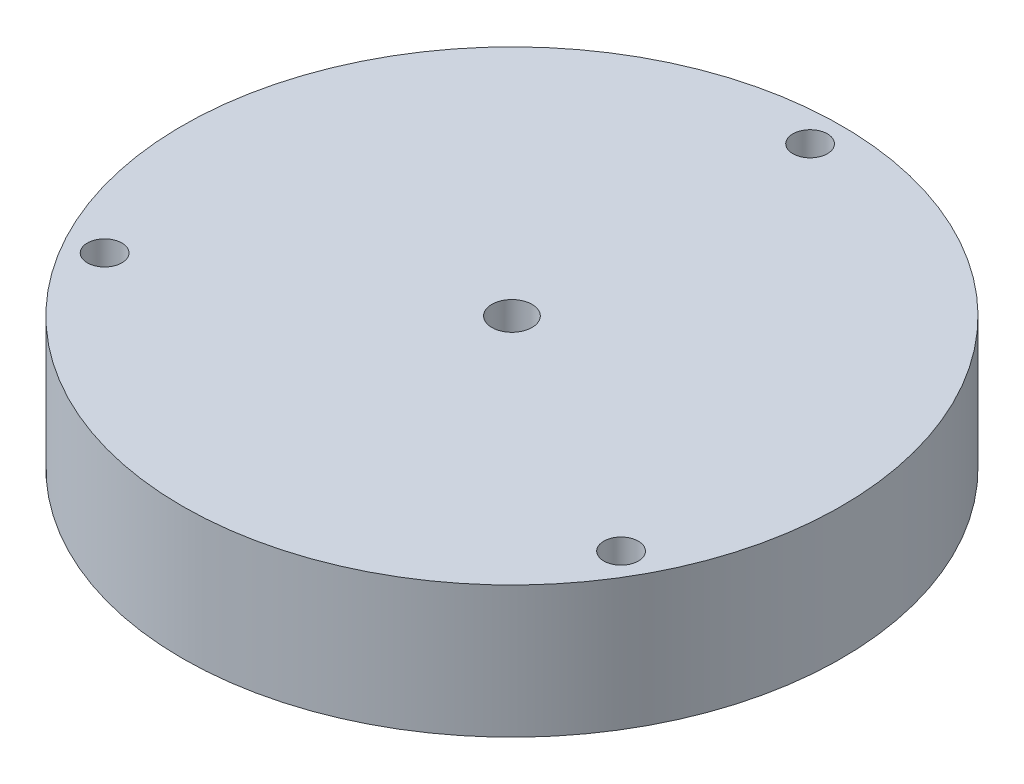
ISO-10303-21;
HEADER;
FILE_DESCRIPTION(('STEP AP214'),'2;1');
FILE_NAME('part.step','',(''),(''),'','','');
FILE_SCHEMA(('AUTOMOTIVE_DESIGN { 1 0 10303 214 1 1 1 1 }'));
ENDSEC;
DATA;
#1=APPLICATION_CONTEXT('core data for automotive mechanical design processes');
#2=APPLICATION_PROTOCOL_DEFINITION('international standard','automotive_design',2000,#1);
#3=PRODUCT_CONTEXT('',#1,'mechanical');
#4=PRODUCT('Part','Part','',(#3));
#5=PRODUCT_RELATED_PRODUCT_CATEGORY('part','',(#4));
#6=PRODUCT_DEFINITION_FORMATION('','',#4);
#7=PRODUCT_DEFINITION_CONTEXT('part definition',#1,'design');
#8=PRODUCT_DEFINITION('design','',#6,#7);
#9=PRODUCT_DEFINITION_SHAPE('','',#8);
#10=(LENGTH_UNIT() NAMED_UNIT(*) SI_UNIT(.MILLI.,.METRE.));
#11=(NAMED_UNIT(*) PLANE_ANGLE_UNIT() SI_UNIT($,.RADIAN.));
#12=(NAMED_UNIT(*) SI_UNIT($,.STERADIAN.) SOLID_ANGLE_UNIT());
#13=UNCERTAINTY_MEASURE_WITH_UNIT(LENGTH_MEASURE(1.E-05),#10,'distance_accuracy_value','');
#14=(GEOMETRIC_REPRESENTATION_CONTEXT(3) GLOBAL_UNCERTAINTY_ASSIGNED_CONTEXT((#13)) GLOBAL_UNIT_ASSIGNED_CONTEXT((#10,
#11,#12)) REPRESENTATION_CONTEXT('',''));
#15=CARTESIAN_POINT('',(0.,0.,0.));
#16=DIRECTION('',(0.,0.,1.));
#17=DIRECTION('',(1.,0.,0.));
#18=AXIS2_PLACEMENT_3D('',#15,#16,#17);
#19=CARTESIAN_POINT('',(-38.6795813318704,18.,29.2598699243729));
#20=DIRECTION('',(0.,-1.,0.));
#21=DIRECTION('',(0.,0.,-1.));
#22=AXIS2_PLACEMENT_3D('',#19,#20,#21);
#23=CYLINDRICAL_SURFACE('',#22,2.);
#24=CARTESIAN_POINT('',(-38.6795813318704,0.,29.2598699243729));
#25=DIRECTION('',(0.,1.,0.));
#26=DIRECTION('',(0.,0.,1.));
#27=AXIS2_PLACEMENT_3D('',#24,#25,#26);
#28=CIRCLE('',#27,2.);
#29=CARTESIAN_POINT('',(-39.6795813318704,0.,27.5278191168041));
#30=VERTEX_POINT('',#29);
#31=CARTESIAN_POINT('',(-40.274615613597,0.,30.4664624985739));
#32=VERTEX_POINT('',#31);
#33=EDGE_CURVE('E202',#30,#32,#28,.T.);
#34=ORIENTED_EDGE('',*,*,#33,.F.);
#35=DIRECTION('',(0.,-1.,0.));
#36=VECTOR('',#35,1.);
#37=CARTESIAN_POINT('',(-39.6795813318704,18.,27.5278191168041));
#38=LINE('',#37,#36);
#39=CARTESIAN_POINT('',(-39.6795813318704,18.,27.5278191168041));
#40=VERTEX_POINT('',#39);
#41=EDGE_CURVE('E45',#40,#30,#38,.T.);
#42=ORIENTED_EDGE('',*,*,#41,.F.);
#43=CARTESIAN_POINT('',(-38.6795813318704,18.,29.2598699243729));
#44=DIRECTION('',(0.,1.,0.));
#45=DIRECTION('',(0.,0.,1.));
#46=AXIS2_PLACEMENT_3D('',#43,#44,#45);
#47=CIRCLE('',#46,2.);
#48=CARTESIAN_POINT('',(-40.274615613597,18.,30.4664624985739));
#49=VERTEX_POINT('',#48);
#50=EDGE_CURVE('E249',#40,#49,#47,.T.);
#51=ORIENTED_EDGE('',*,*,#50,.T.);
#52=DIRECTION('',(0.,-1.,0.));
#53=VECTOR('',#52,1.);
#54=CARTESIAN_POINT('',(-40.274615613597,18.,30.4664624985739));
#55=LINE('',#54,#53);
#56=EDGE_CURVE('E117',#49,#32,#55,.T.);
#57=ORIENTED_EDGE('',*,*,#56,.T.);
#58=EDGE_LOOP('',(#34,#42,#51,#57));
#59=FACE_BOUND('',#58,.T.);
#60=ADVANCED_FACE('F36',(#59),#23,.F.);
#61=CARTESIAN_POINT('',(2.00000000000007,18.,3.46410161513791));
#62=DIRECTION('',(-0.499999999999997,0.,-0.86602540378444));
#63=DIRECTION('',(-0.86602540378444,0.,0.499999999999997));
#64=AXIS2_PLACEMENT_3D('',#61,#62,#63);
#65=PLANE('',#64);
#66=DIRECTION('',(0.86602540378444,0.,-0.499999999999997));
#67=VECTOR('',#66,1.);
#68=CARTESIAN_POINT('',(2.00000000000007,0.,3.46410161513791));
#69=LINE('',#68,#67);
#70=CARTESIAN_POINT('',(-39.1362066797609,0.,27.2141016151376));
#71=VERTEX_POINT('',#70);
#72=EDGE_CURVE('E205',#30,#71,#69,.T.);
#73=ORIENTED_EDGE('',*,*,#72,.T.);
#74=DIRECTION('',(0.,-1.,0.));
#75=VECTOR('',#74,1.);
#76=CARTESIAN_POINT('',(-39.1362066797609,18.,27.2141016151376));
#77=LINE('',#76,#75);
#78=CARTESIAN_POINT('',(-39.1362066797609,18.,27.2141016151376));
#79=VERTEX_POINT('',#78);
#80=EDGE_CURVE('E279',#79,#71,#77,.T.);
#81=ORIENTED_EDGE('',*,*,#80,.F.);
#82=DIRECTION('',(0.86602540378444,0.,-0.499999999999997));
#83=VECTOR('',#82,1.);
#84=CARTESIAN_POINT('',(2.00000000000007,18.,3.46410161513791));
#85=LINE('',#84,#83);
#86=EDGE_CURVE('E309',#40,#79,#85,.T.);
#87=ORIENTED_EDGE('',*,*,#86,.F.);
#88=ORIENTED_EDGE('',*,*,#41,.T.);
#89=EDGE_LOOP('',(#73,#81,#87,#88));
#90=FACE_BOUND('',#89,.T.);
#91=ADVANCED_FACE('F367',(#90),#65,.F.);
#92=CARTESIAN_POINT('',(-41.1362066797611,18.,23.7499999999996));
#93=DIRECTION('',(0.,-1.,0.));
#94=DIRECTION('',(0.,0.,-1.));
#95=AXIS2_PLACEMENT_3D('',#92,#93,#94);
#96=CYLINDRICAL_SURFACE('',#95,4.);
#97=CARTESIAN_POINT('',(-41.1362066797611,0.,23.7499999999996));
#98=DIRECTION('',(0.,1.,0.));
#99=DIRECTION('',(0.,0.,1.));
#100=AXIS2_PLACEMENT_3D('',#97,#98,#99);
#101=CIRCLE('',#100,4.);
#102=CARTESIAN_POINT('',(-43.1362066797609,0.,20.2858983848621));
#103=VERTEX_POINT('',#102);
#104=EDGE_CURVE('E208',#71,#103,#101,.T.);
#105=ORIENTED_EDGE('',*,*,#104,.T.);
#106=DIRECTION('',(0.,-1.,0.));
#107=VECTOR('',#106,1.);
#108=CARTESIAN_POINT('',(-43.1362066797609,18.,20.2858983848621));
#109=LINE('',#108,#107);
#110=CARTESIAN_POINT('',(-43.1362066797609,18.,20.2858983848621));
#111=VERTEX_POINT('',#110);
#112=EDGE_CURVE('E277',#111,#103,#109,.T.);
#113=ORIENTED_EDGE('',*,*,#112,.F.);
#114=CARTESIAN_POINT('',(-41.1362066797611,18.,23.7499999999996));
#115=DIRECTION('',(0.,1.,0.));
#116=DIRECTION('',(0.,0.,1.));
#117=AXIS2_PLACEMENT_3D('',#114,#115,#116);
#118=CIRCLE('',#117,4.);
#119=EDGE_CURVE('E312',#79,#111,#118,.T.);
#120=ORIENTED_EDGE('',*,*,#119,.F.);
#121=ORIENTED_EDGE('',*,*,#80,.T.);
#122=EDGE_LOOP('',(#105,#113,#120,#121));
#123=FACE_BOUND('',#122,.T.);
#124=ADVANCED_FACE('F371',(#123),#96,.T.);
#125=CARTESIAN_POINT('',(-1.9999999999999,18.,-3.46410161513761));
#126=DIRECTION('',(-0.499999999999997,0.,-0.86602540378444));
#127=DIRECTION('',(-0.86602540378444,0.,0.499999999999997));
#128=AXIS2_PLACEMENT_3D('',#125,#126,#127);
#129=PLANE('',#128);
#130=DIRECTION('',(0.86602540378444,0.,-0.499999999999997));
#131=VECTOR('',#130,1.);
#132=CARTESIAN_POINT('',(-1.9999999999999,0.,-3.46410161513761));
#133=LINE('',#132,#131);
#134=CARTESIAN_POINT('',(-43.6795813318704,0.,20.5996158865285));
#135=VERTEX_POINT('',#134);
#136=EDGE_CURVE('E211',#135,#103,#133,.T.);
#137=ORIENTED_EDGE('',*,*,#136,.F.);
#138=DIRECTION('',(0.,-1.,0.));
#139=VECTOR('',#138,1.);
#140=CARTESIAN_POINT('',(-43.6795813318704,18.,20.5996158865285));
#141=LINE('',#140,#139);
#142=CARTESIAN_POINT('',(-43.6795813318704,18.,20.5996158865285));
#143=VERTEX_POINT('',#142);
#144=EDGE_CURVE('E275',#143,#135,#141,.T.);
#145=ORIENTED_EDGE('',*,*,#144,.F.);
#146=DIRECTION('',(0.86602540378444,0.,-0.499999999999997));
#147=VECTOR('',#146,1.);
#148=CARTESIAN_POINT('',(-1.9999999999999,18.,-3.46410161513761));
#149=LINE('',#148,#147);
#150=EDGE_CURVE('E315',#143,#111,#149,.T.);
#151=ORIENTED_EDGE('',*,*,#150,.T.);
#152=ORIENTED_EDGE('',*,*,#112,.T.);
#153=EDGE_LOOP('',(#137,#145,#151,#152));
#154=FACE_BOUND('',#153,.T.);
#155=ADVANCED_FACE('F679',(#154),#129,.T.);
#156=CARTESIAN_POINT('',(-44.6795813318704,18.,18.8675650789597));
#157=DIRECTION('',(0.,-1.,0.));
#158=DIRECTION('',(0.,0.,-1.));
#159=AXIS2_PLACEMENT_3D('',#156,#157,#158);
#160=CYLINDRICAL_SURFACE('',#159,2.);
#161=CARTESIAN_POINT('',(-44.6795813318704,0.,18.8675650789597));
#162=DIRECTION('',(0.,1.,0.));
#163=DIRECTION('',(0.,0.,1.));
#164=AXIS2_PLACEMENT_3D('',#161,#162,#163);
#165=CIRCLE('',#164,2.);
#166=CARTESIAN_POINT('',(-46.5220382940094,0.,19.6456089997415));
#167=VERTEX_POINT('',#166);
#168=EDGE_CURVE('E214',#135,#167,#165,.F.);
#169=ORIENTED_EDGE('',*,*,#168,.T.);
#170=DIRECTION('',(0.,-1.,0.));
#171=VECTOR('',#170,1.);
#172=CARTESIAN_POINT('',(-46.5220382940094,18.,19.6456089997415));
#173=LINE('',#172,#171);
#174=CARTESIAN_POINT('',(-46.5220382940094,18.,19.6456089997415));
#175=VERTEX_POINT('',#174);
#176=EDGE_CURVE('E272',#175,#167,#173,.T.);
#177=ORIENTED_EDGE('',*,*,#176,.F.);
#178=CARTESIAN_POINT('',(-44.6795813318704,18.,18.8675650789597));
#179=DIRECTION('',(0.,1.,0.));
#180=DIRECTION('',(0.,0.,1.));
#181=AXIS2_PLACEMENT_3D('',#178,#179,#180);
#182=CIRCLE('',#181,2.);
#183=EDGE_CURVE('E318',#143,#175,#182,.F.);
#184=ORIENTED_EDGE('',*,*,#183,.F.);
#185=ORIENTED_EDGE('',*,*,#144,.T.);
#186=EDGE_LOOP('',(#169,#177,#184,#185));
#187=FACE_BOUND('',#186,.T.);
#188=ADVANCED_FACE('F668',(#187),#160,.F.);
#189=CARTESIAN_POINT('',(0.,18.,0.));
#190=DIRECTION('',(0.,-1.,0.));
#191=DIRECTION('',(0.,0.,-1.));
#192=AXIS2_PLACEMENT_3D('',#189,#190,#191);
#193=CYLINDRICAL_SURFACE('',#192,50.5);
#194=CARTESIAN_POINT('',(0.,0.,0.));
#195=DIRECTION('',(0.,1.,0.));
#196=DIRECTION('',(0.,0.,1.));
#197=AXIS2_PLACEMENT_3D('',#194,#195,#196);
#198=CIRCLE('',#197,50.5);
#199=CARTESIAN_POINT('',(-6.24742268041235,0.,-50.1120714983154));
#200=VERTEX_POINT('',#199);
#201=EDGE_CURVE('E216',#167,#200,#198,.F.);
#202=ORIENTED_EDGE('',*,*,#201,.T.);
#203=DIRECTION('',(0.,-1.,0.));
#204=VECTOR('',#203,1.);
#205=CARTESIAN_POINT('',(-6.24742268041235,18.,-50.1120714983154));
#206=LINE('',#205,#204);
#207=CARTESIAN_POINT('',(-6.24742268041235,18.,-50.1120714983154));
#208=VERTEX_POINT('',#207);
#209=EDGE_CURVE('E270',#208,#200,#206,.T.);
#210=ORIENTED_EDGE('',*,*,#209,.F.);
#211=CARTESIAN_POINT('',(0.,18.,0.));
#212=DIRECTION('',(0.,1.,0.));
#213=DIRECTION('',(0.,0.,1.));
#214=AXIS2_PLACEMENT_3D('',#211,#212,#213);
#215=CIRCLE('',#214,50.5);
#216=EDGE_CURVE('E321',#175,#208,#215,.F.);
#217=ORIENTED_EDGE('',*,*,#216,.F.);
#218=ORIENTED_EDGE('',*,*,#176,.T.);
#219=EDGE_LOOP('',(#202,#210,#217,#218));
#220=FACE_BOUND('',#219,.T.);
#221=ADVANCED_FACE('F658',(#220),#193,.F.);
#222=CARTESIAN_POINT('',(-6.,18.,-48.1274350033326));
#223=DIRECTION('',(0.,-1.,0.));
#224=DIRECTION('',(0.,0.,-1.));
#225=AXIS2_PLACEMENT_3D('',#222,#223,#224);
#226=CYLINDRICAL_SURFACE('',#225,2.);
#227=CARTESIAN_POINT('',(-6.,0.,-48.1274350033326));
#228=DIRECTION('',(0.,1.,0.));
#229=DIRECTION('',(0.,0.,1.));
#230=AXIS2_PLACEMENT_3D('',#227,#228,#229);
#231=CIRCLE('',#230,2.);
#232=CARTESIAN_POINT('',(-4.,0.,-48.1274350033326));
#233=VERTEX_POINT('',#232);
#234=EDGE_CURVE('E219',#233,#200,#231,.T.);
#235=ORIENTED_EDGE('',*,*,#234,.F.);
#236=DIRECTION('',(0.,-1.,0.));
#237=VECTOR('',#236,1.);
#238=CARTESIAN_POINT('',(-4.,18.,-48.1274350033326));
#239=LINE('',#238,#237);
#240=CARTESIAN_POINT('',(-4.,18.,-48.1274350033326));
#241=VERTEX_POINT('',#240);
#242=EDGE_CURVE('E268',#241,#233,#239,.T.);
#243=ORIENTED_EDGE('',*,*,#242,.F.);
#244=CARTESIAN_POINT('',(-6.,18.,-48.1274350033326));
#245=DIRECTION('',(0.,1.,0.));
#246=DIRECTION('',(0.,0.,1.));
#247=AXIS2_PLACEMENT_3D('',#244,#245,#246);
#248=CIRCLE('',#247,2.);
#249=EDGE_CURVE('E324',#241,#208,#248,.T.);
#250=ORIENTED_EDGE('',*,*,#249,.T.);
#251=ORIENTED_EDGE('',*,*,#209,.T.);
#252=EDGE_LOOP('',(#235,#243,#250,#251));
#253=FACE_BOUND('',#252,.T.);
#254=ADVANCED_FACE('F648',(#253),#226,.F.);
#255=CARTESIAN_POINT('',(-4.,18.,0.));
#256=DIRECTION('',(1.,0.,0.));
#257=DIRECTION('',(0.,0.,-1.));
#258=AXIS2_PLACEMENT_3D('',#255,#256,#257);
#259=PLANE('',#258);
#260=DIRECTION('',(0.,0.,1.));
#261=VECTOR('',#260,1.);
#262=CARTESIAN_POINT('',(-4.,0.,0.));
#263=LINE('',#262,#261);
#264=CARTESIAN_POINT('',(-4.,0.,-47.5));
#265=VERTEX_POINT('',#264);
#266=EDGE_CURVE('E222',#233,#265,#263,.T.);
#267=ORIENTED_EDGE('',*,*,#266,.T.);
#268=DIRECTION('',(0.,-1.,0.));
#269=VECTOR('',#268,1.);
#270=CARTESIAN_POINT('',(-4.,18.,-47.5));
#271=LINE('',#270,#269);
#272=CARTESIAN_POINT('',(-4.,18.,-47.5));
#273=VERTEX_POINT('',#272);
#274=EDGE_CURVE('E265',#273,#265,#271,.T.);
#275=ORIENTED_EDGE('',*,*,#274,.F.);
#276=DIRECTION('',(0.,0.,1.));
#277=VECTOR('',#276,1.);
#278=CARTESIAN_POINT('',(-4.,18.,0.));
#279=LINE('',#278,#277);
#280=EDGE_CURVE('E327',#241,#273,#279,.T.);
#281=ORIENTED_EDGE('',*,*,#280,.F.);
#282=ORIENTED_EDGE('',*,*,#242,.T.);
#283=EDGE_LOOP('',(#267,#275,#281,#282));
#284=FACE_BOUND('',#283,.T.);
#285=ADVANCED_FACE('F638',(#284),#259,.F.);
#286=CARTESIAN_POINT('',(0.,18.,-47.5));
#287=DIRECTION('',(0.,-1.,0.));
#288=DIRECTION('',(0.,0.,-1.));
#289=AXIS2_PLACEMENT_3D('',#286,#287,#288);
#290=CYLINDRICAL_SURFACE('',#289,4.);
#291=CARTESIAN_POINT('',(0.,0.,-47.5));
#292=DIRECTION('',(0.,1.,0.));
#293=DIRECTION('',(0.,0.,1.));
#294=AXIS2_PLACEMENT_3D('',#291,#292,#293);
#295=CIRCLE('',#294,4.);
#296=CARTESIAN_POINT('',(4.,0.,-47.5));
#297=VERTEX_POINT('',#296);
#298=EDGE_CURVE('E224',#265,#297,#295,.T.);
#299=ORIENTED_EDGE('',*,*,#298,.T.);
#300=DIRECTION('',(0.,-1.,0.));
#301=VECTOR('',#300,1.);
#302=CARTESIAN_POINT('',(4.,18.,-47.5));
#303=LINE('',#302,#301);
#304=CARTESIAN_POINT('',(4.,18.,-47.5));
#305=VERTEX_POINT('',#304);
#306=EDGE_CURVE('E263',#305,#297,#303,.T.);
#307=ORIENTED_EDGE('',*,*,#306,.F.);
#308=CARTESIAN_POINT('',(0.,18.,-47.5));
#309=DIRECTION('',(0.,1.,0.));
#310=DIRECTION('',(0.,0.,1.));
#311=AXIS2_PLACEMENT_3D('',#308,#309,#310);
#312=CIRCLE('',#311,4.);
#313=EDGE_CURVE('E330',#273,#305,#312,.T.);
#314=ORIENTED_EDGE('',*,*,#313,.F.);
#315=ORIENTED_EDGE('',*,*,#274,.T.);
#316=EDGE_LOOP('',(#299,#307,#314,#315));
#317=FACE_BOUND('',#316,.T.);
#318=ADVANCED_FACE('F628',(#317),#290,.T.);
#319=CARTESIAN_POINT('',(4.,18.,0.));
#320=DIRECTION('',(1.,0.,0.));
#321=DIRECTION('',(0.,0.,-1.));
#322=AXIS2_PLACEMENT_3D('',#319,#320,#321);
#323=PLANE('',#322);
#324=DIRECTION('',(0.,0.,1.));
#325=VECTOR('',#324,1.);
#326=CARTESIAN_POINT('',(4.,0.,0.));
#327=LINE('',#326,#325);
#328=CARTESIAN_POINT('',(4.,0.,-48.1274350033326));
#329=VERTEX_POINT('',#328);
#330=EDGE_CURVE('E227',#329,#297,#327,.T.);
#331=ORIENTED_EDGE('',*,*,#330,.F.);
#332=DIRECTION('',(0.,-1.,0.));
#333=VECTOR('',#332,1.);
#334=CARTESIAN_POINT('',(4.,18.,-48.1274350033326));
#335=LINE('',#334,#333);
#336=CARTESIAN_POINT('',(4.,18.,-48.1274350033326));
#337=VERTEX_POINT('',#336);
#338=EDGE_CURVE('E261',#337,#329,#335,.T.);
#339=ORIENTED_EDGE('',*,*,#338,.F.);
#340=DIRECTION('',(0.,0.,1.));
#341=VECTOR('',#340,1.);
#342=CARTESIAN_POINT('',(4.,18.,0.));
#343=LINE('',#342,#341);
#344=EDGE_CURVE('E333',#337,#305,#343,.T.);
#345=ORIENTED_EDGE('',*,*,#344,.T.);
#346=ORIENTED_EDGE('',*,*,#306,.T.);
#347=EDGE_LOOP('',(#331,#339,#345,#346));
#348=FACE_BOUND('',#347,.T.);
#349=ADVANCED_FACE('F618',(#348),#323,.T.);
#350=CARTESIAN_POINT('',(6.,18.,-48.1274350033326));
#351=DIRECTION('',(0.,-1.,0.));
#352=DIRECTION('',(0.,0.,-1.));
#353=AXIS2_PLACEMENT_3D('',#350,#351,#352);
#354=CYLINDRICAL_SURFACE('',#353,2.);
#355=CARTESIAN_POINT('',(6.,0.,-48.1274350033326));
#356=DIRECTION('',(0.,1.,0.));
#357=DIRECTION('',(0.,0.,1.));
#358=AXIS2_PLACEMENT_3D('',#355,#356,#357);
#359=CIRCLE('',#358,2.);
#360=CARTESIAN_POINT('',(6.24742268041237,0.,-50.1120714983154));
#361=VERTEX_POINT('',#360);
#362=EDGE_CURVE('E230',#329,#361,#359,.F.);
#363=ORIENTED_EDGE('',*,*,#362,.T.);
#364=DIRECTION('',(0.,-1.,0.));
#365=VECTOR('',#364,1.);
#366=CARTESIAN_POINT('',(6.24742268041237,18.,-50.1120714983154));
#367=LINE('',#366,#365);
#368=CARTESIAN_POINT('',(6.24742268041237,18.,-50.1120714983154));
#369=VERTEX_POINT('',#368);
#370=EDGE_CURVE('E258',#369,#361,#367,.T.);
#371=ORIENTED_EDGE('',*,*,#370,.F.);
#372=CARTESIAN_POINT('',(6.,18.,-48.1274350033326));
#373=DIRECTION('',(0.,1.,0.));
#374=DIRECTION('',(0.,0.,1.));
#375=AXIS2_PLACEMENT_3D('',#372,#373,#374);
#376=CIRCLE('',#375,2.);
#377=EDGE_CURVE('E336',#337,#369,#376,.F.);
#378=ORIENTED_EDGE('',*,*,#377,.F.);
#379=ORIENTED_EDGE('',*,*,#338,.T.);
#380=EDGE_LOOP('',(#363,#371,#378,#379));
#381=FACE_BOUND('',#380,.T.);
#382=ADVANCED_FACE('F608',(#381),#354,.F.);
#383=CARTESIAN_POINT('',(0.,18.,0.));
#384=DIRECTION('',(0.,-1.,0.));
#385=DIRECTION('',(0.,0.,-1.));
#386=AXIS2_PLACEMENT_3D('',#383,#384,#385);
#387=CYLINDRICAL_SURFACE('',#386,50.5);
#388=CARTESIAN_POINT('',(0.,0.,0.));
#389=DIRECTION('',(0.,1.,0.));
#390=DIRECTION('',(0.,0.,1.));
#391=AXIS2_PLACEMENT_3D('',#388,#389,#390);
#392=CIRCLE('',#391,50.5);
#393=CARTESIAN_POINT('',(46.5220382940094,0.,19.6456089997415));
#394=VERTEX_POINT('',#393);
#395=EDGE_CURVE('E232',#361,#394,#392,.F.);
#396=ORIENTED_EDGE('',*,*,#395,.T.);
#397=DIRECTION('',(0.,-1.,0.));
#398=VECTOR('',#397,1.);
#399=CARTESIAN_POINT('',(46.5220382940094,18.,19.6456089997415));
#400=LINE('',#399,#398);
#401=CARTESIAN_POINT('',(46.5220382940094,18.,19.6456089997415));
#402=VERTEX_POINT('',#401);
#403=EDGE_CURVE('E256',#402,#394,#400,.T.);
#404=ORIENTED_EDGE('',*,*,#403,.F.);
#405=CARTESIAN_POINT('',(0.,18.,0.));
#406=DIRECTION('',(0.,1.,0.));
#407=DIRECTION('',(0.,0.,1.));
#408=AXIS2_PLACEMENT_3D('',#405,#406,#407);
#409=CIRCLE('',#408,50.5);
#410=EDGE_CURVE('E339',#369,#402,#409,.F.);
#411=ORIENTED_EDGE('',*,*,#410,.F.);
#412=ORIENTED_EDGE('',*,*,#370,.T.);
#413=EDGE_LOOP('',(#396,#404,#411,#412));
#414=FACE_BOUND('',#413,.T.);
#415=ADVANCED_FACE('F349',(#414),#387,.F.);
#416=CARTESIAN_POINT('',(44.6795813318704,18.,18.8675650789596));
#417=DIRECTION('',(0.,-1.,0.));
#418=DIRECTION('',(0.,0.,-1.));
#419=AXIS2_PLACEMENT_3D('',#416,#417,#418);
#420=CYLINDRICAL_SURFACE('',#419,2.00000000000001);
#421=CARTESIAN_POINT('',(44.6795813318704,0.,18.8675650789596));
#422=DIRECTION('',(0.,1.,0.));
#423=DIRECTION('',(0.,0.,1.));
#424=AXIS2_PLACEMENT_3D('',#421,#422,#423);
#425=CIRCLE('',#424,2.00000000000001);
#426=CARTESIAN_POINT('',(43.6795813318704,0.,20.5996158865285));
#427=VERTEX_POINT('',#426);
#428=EDGE_CURVE('E235',#427,#394,#425,.T.);
#429=ORIENTED_EDGE('',*,*,#428,.F.);
#430=DIRECTION('',(0.,-1.,0.));
#431=VECTOR('',#430,1.);
#432=CARTESIAN_POINT('',(43.6795813318704,18.,20.5996158865285));
#433=LINE('',#432,#431);
#434=CARTESIAN_POINT('',(43.6795813318704,18.,20.5996158865285));
#435=VERTEX_POINT('',#434);
#436=EDGE_CURVE('E254',#435,#427,#433,.T.);
#437=ORIENTED_EDGE('',*,*,#436,.F.);
#438=CARTESIAN_POINT('',(44.6795813318704,18.,18.8675650789596));
#439=DIRECTION('',(0.,1.,0.));
#440=DIRECTION('',(0.,0.,1.));
#441=AXIS2_PLACEMENT_3D('',#438,#439,#440);
#442=CIRCLE('',#441,2.00000000000001);
#443=EDGE_CURVE('E194',#435,#402,#442,.T.);
#444=ORIENTED_EDGE('',*,*,#443,.T.);
#445=ORIENTED_EDGE('',*,*,#403,.T.);
#446=EDGE_LOOP('',(#429,#437,#444,#445));
#447=FACE_BOUND('',#446,.T.);
#448=ADVANCED_FACE('F344',(#447),#420,.F.);
#449=CARTESIAN_POINT('',(2.00000000000021,18.,-3.46410161513805));
#450=DIRECTION('',(-0.500000000000006,0.,0.866025403784435));
#451=DIRECTION('',(0.866025403784435,0.,0.500000000000006));
#452=AXIS2_PLACEMENT_3D('',#449,#450,#451);
#453=PLANE('',#452);
#454=DIRECTION('',(-0.866025403784435,0.,-0.500000000000006));
#455=VECTOR('',#454,1.);
#456=CARTESIAN_POINT('',(2.00000000000021,0.,-3.46410161513805));
#457=LINE('',#456,#455);
#458=CARTESIAN_POINT('',(43.1362066797608,0.,20.2858983848623));
#459=VERTEX_POINT('',#458);
#460=EDGE_CURVE('E238',#427,#459,#457,.T.);
#461=ORIENTED_EDGE('',*,*,#460,.T.);
#462=DIRECTION('',(0.,-1.,0.));
#463=VECTOR('',#462,1.);
#464=CARTESIAN_POINT('',(43.1362066797608,18.,20.2858983848623));
#465=LINE('',#464,#463);
#466=CARTESIAN_POINT('',(43.1362066797608,18.,20.2858983848623));
#467=VERTEX_POINT('',#466);
#468=EDGE_CURVE('E178',#467,#459,#465,.T.);
#469=ORIENTED_EDGE('',*,*,#468,.F.);
#470=DIRECTION('',(-0.866025403784435,0.,-0.500000000000006));
#471=VECTOR('',#470,1.);
#472=CARTESIAN_POINT('',(2.00000000000021,18.,-3.46410161513805));
#473=LINE('',#472,#471);
#474=EDGE_CURVE('E192',#435,#467,#473,.T.);
#475=ORIENTED_EDGE('',*,*,#474,.F.);
#476=ORIENTED_EDGE('',*,*,#436,.T.);
#477=EDGE_LOOP('',(#461,#469,#475,#476));
#478=FACE_BOUND('',#477,.T.);
#479=ADVANCED_FACE('F357',(#478),#453,.F.);
#480=CARTESIAN_POINT('',(41.1362066797607,18.,23.7500000000002));
#481=DIRECTION('',(0.,-1.,0.));
#482=DIRECTION('',(0.,0.,-1.));
#483=AXIS2_PLACEMENT_3D('',#480,#481,#482);
#484=CYLINDRICAL_SURFACE('',#483,4.);
#485=CARTESIAN_POINT('',(41.1362066797607,0.,23.7500000000002));
#486=DIRECTION('',(0.,1.,0.));
#487=DIRECTION('',(0.,0.,1.));
#488=AXIS2_PLACEMENT_3D('',#485,#486,#487);
#489=CIRCLE('',#488,4.);
#490=CARTESIAN_POINT('',(39.1362066797608,0.,27.2141016151378));
#491=VERTEX_POINT('',#490);
#492=EDGE_CURVE('E174',#459,#491,#489,.T.);
#493=ORIENTED_EDGE('',*,*,#492,.T.);
#494=DIRECTION('',(0.,-1.,0.));
#495=VECTOR('',#494,1.);
#496=CARTESIAN_POINT('',(39.1362066797608,18.,27.2141016151378));
#497=LINE('',#496,#495);
#498=CARTESIAN_POINT('',(39.1362066797608,18.,27.2141016151378));
#499=VERTEX_POINT('',#498);
#500=EDGE_CURVE('E166',#499,#491,#497,.T.);
#501=ORIENTED_EDGE('',*,*,#500,.F.);
#502=CARTESIAN_POINT('',(41.1362066797607,18.,23.7500000000002));
#503=DIRECTION('',(0.,1.,0.));
#504=DIRECTION('',(0.,0.,1.));
#505=AXIS2_PLACEMENT_3D('',#502,#503,#504);
#506=CIRCLE('',#505,4.);
#507=EDGE_CURVE('E171',#467,#499,#506,.T.);
#508=ORIENTED_EDGE('',*,*,#507,.F.);
#509=ORIENTED_EDGE('',*,*,#468,.T.);
#510=EDGE_LOOP('',(#493,#501,#508,#509));
#511=FACE_BOUND('',#510,.T.);
#512=ADVANCED_FACE('F168',(#511),#484,.T.);
#513=CARTESIAN_POINT('',(-2.00000000000004,18.,3.46410161513785));
#514=DIRECTION('',(-0.499999999999998,0.,0.86602540378444));
#515=DIRECTION('',(0.86602540378444,0.,0.499999999999998));
#516=AXIS2_PLACEMENT_3D('',#513,#514,#515);
#517=PLANE('',#516);
#518=DIRECTION('',(-0.86602540378444,0.,-0.499999999999998));
#519=VECTOR('',#518,1.);
#520=CARTESIAN_POINT('',(-2.00000000000004,0.,3.46410161513785));
#521=LINE('',#520,#519);
#522=CARTESIAN_POINT('',(39.6795813318704,0.,27.527819116804));
#523=VERTEX_POINT('',#522);
#524=EDGE_CURVE('E241',#523,#491,#521,.T.);
#525=ORIENTED_EDGE('',*,*,#524,.F.);
#526=DIRECTION('',(0.,-1.,0.));
#527=VECTOR('',#526,1.);
#528=CARTESIAN_POINT('',(39.6795813318704,18.,27.527819116804));
#529=LINE('',#528,#527);
#530=CARTESIAN_POINT('',(39.6795813318704,18.,27.527819116804));
#531=VERTEX_POINT('',#530);
#532=EDGE_CURVE('E179',#531,#523,#529,.T.);
#533=ORIENTED_EDGE('',*,*,#532,.F.);
#534=DIRECTION('',(-0.86602540378444,0.,-0.499999999999998));
#535=VECTOR('',#534,1.);
#536=CARTESIAN_POINT('',(-2.00000000000004,18.,3.46410161513785));
#537=LINE('',#536,#535);
#538=EDGE_CURVE('E182',#531,#499,#537,.T.);
#539=ORIENTED_EDGE('',*,*,#538,.T.);
#540=ORIENTED_EDGE('',*,*,#500,.T.);
#541=EDGE_LOOP('',(#525,#533,#539,#540));
#542=FACE_BOUND('',#541,.T.);
#543=ADVANCED_FACE('F183',(#542),#517,.T.);
#544=CARTESIAN_POINT('',(38.6795813318704,18.,29.2598699243729));
#545=DIRECTION('',(0.,-1.,0.));
#546=DIRECTION('',(0.,0.,-1.));
#547=AXIS2_PLACEMENT_3D('',#544,#545,#546);
#548=CYLINDRICAL_SURFACE('',#547,1.99999999999999);
#549=CARTESIAN_POINT('',(38.6795813318704,0.,29.2598699243729));
#550=DIRECTION('',(0.,1.,0.));
#551=DIRECTION('',(0.,0.,1.));
#552=AXIS2_PLACEMENT_3D('',#549,#550,#551);
#553=CIRCLE('',#552,1.99999999999999);
#554=CARTESIAN_POINT('',(40.274615613597,0.,30.4664624985739));
#555=VERTEX_POINT('',#554);
#556=EDGE_CURVE('E110',#523,#555,#553,.F.);
#557=ORIENTED_EDGE('',*,*,#556,.T.);
#558=DIRECTION('',(0.,-1.,0.));
#559=VECTOR('',#558,1.);
#560=CARTESIAN_POINT('',(40.274615613597,18.,30.4664624985739));
#561=LINE('',#560,#559);
#562=CARTESIAN_POINT('',(40.274615613597,18.,30.4664624985739));
#563=VERTEX_POINT('',#562);
#564=EDGE_CURVE('E53',#563,#555,#561,.T.);
#565=ORIENTED_EDGE('',*,*,#564,.F.);
#566=CARTESIAN_POINT('',(38.6795813318704,18.,29.2598699243729));
#567=DIRECTION('',(0.,1.,0.));
#568=DIRECTION('',(0.,0.,1.));
#569=AXIS2_PLACEMENT_3D('',#566,#567,#568);
#570=CIRCLE('',#569,1.99999999999999);
#571=EDGE_CURVE('E186',#531,#563,#570,.F.);
#572=ORIENTED_EDGE('',*,*,#571,.F.);
#573=ORIENTED_EDGE('',*,*,#532,.T.);
#574=EDGE_LOOP('',(#557,#565,#572,#573));
#575=FACE_BOUND('',#574,.T.);
#576=ADVANCED_FACE('F381',(#575),#548,.F.);
#577=CARTESIAN_POINT('',(0.,18.,0.));
#578=DIRECTION('',(0.,-1.,0.));
#579=DIRECTION('',(0.,0.,-1.));
#580=AXIS2_PLACEMENT_3D('',#577,#578,#579);
#581=CYLINDRICAL_SURFACE('',#580,50.5);
#582=CARTESIAN_POINT('',(0.,0.,0.));
#583=DIRECTION('',(0.,1.,0.));
#584=DIRECTION('',(0.,0.,1.));
#585=AXIS2_PLACEMENT_3D('',#582,#583,#584);
#586=CIRCLE('',#585,50.5);
#587=EDGE_CURVE('E244',#555,#32,#586,.F.);
#588=ORIENTED_EDGE('',*,*,#587,.T.);
#589=ORIENTED_EDGE('',*,*,#56,.F.);
#590=CARTESIAN_POINT('',(0.,18.,0.));
#591=DIRECTION('',(0.,1.,0.));
#592=DIRECTION('',(0.,0.,1.));
#593=AXIS2_PLACEMENT_3D('',#590,#591,#592);
#594=CIRCLE('',#593,50.5);
#595=EDGE_CURVE('E199',#563,#49,#594,.F.);
#596=ORIENTED_EDGE('',*,*,#595,.F.);
#597=ORIENTED_EDGE('',*,*,#564,.T.);
#598=EDGE_LOOP('',(#588,#589,#596,#597));
#599=FACE_BOUND('',#598,.T.);
#600=ADVANCED_FACE('F380',(#599),#581,.F.);
#601=CARTESIAN_POINT('',(0.,18.,0.));
#602=DIRECTION('',(0.,-1.,0.));
#603=DIRECTION('',(0.,0.,-1.));
#604=AXIS2_PLACEMENT_3D('',#601,#602,#603);
#605=CYLINDRICAL_SURFACE('',#604,52.5);
#606=CARTESIAN_POINT('',(0.,0.,0.));
#607=DIRECTION('',(0.,1.,0.));
#608=DIRECTION('',(0.,0.,1.));
#609=AXIS2_PLACEMENT_3D('',#606,#607,#608);
#610=CIRCLE('',#609,52.5);
#611=CARTESIAN_POINT('',(0.,0.,52.5));
#612=VERTEX_POINT('',#611);
#613=EDGE_CURVE('E246',#612,#612,#610,.T.);
#614=ORIENTED_EDGE('',*,*,#613,.T.);
#615=EDGE_LOOP('',(#614));
#616=FACE_BOUND('',#615,.T.);
#617=CARTESIAN_POINT('',(0.,21.,0.));
#618=DIRECTION('',(0.,1.,0.));
#619=DIRECTION('',(0.,0.,1.));
#620=AXIS2_PLACEMENT_3D('',#617,#618,#619);
#621=CIRCLE('',#620,52.5);
#622=CARTESIAN_POINT('',(0.,21.,52.5));
#623=VERTEX_POINT('',#622);
#624=EDGE_CURVE('E206',#623,#623,#621,.T.);
#625=ORIENTED_EDGE('',*,*,#624,.F.);
#626=EDGE_LOOP('',(#625));
#627=FACE_BOUND('',#626,.T.);
#628=ADVANCED_FACE('F388',(#616,#627),#605,.T.);
#629=CARTESIAN_POINT('',(0.,0.,0.));
#630=DIRECTION('',(0.,1.,0.));
#631=DIRECTION('',(0.,0.,1.));
#632=AXIS2_PLACEMENT_3D('',#629,#630,#631);
#633=PLANE('',#632);
#634=CARTESIAN_POINT('',(0.,0.,-47.5));
#635=DIRECTION('',(0.,-1.,0.));
#636=DIRECTION('',(0.,0.,-1.));
#637=AXIS2_PLACEMENT_3D('',#634,#635,#636);
#638=CIRCLE('',#637,1.55);
#639=CARTESIAN_POINT('',(0.,0.,-49.05));
#640=VERTEX_POINT('',#639);
#641=EDGE_CURVE('E287',#640,#640,#638,.T.);
#642=ORIENTED_EDGE('',*,*,#641,.F.);
#643=EDGE_LOOP('',(#642));
#644=FACE_BOUND('',#643,.T.);
#645=CARTESIAN_POINT('',(-41.1362066797608,0.,23.75));
#646=DIRECTION('',(0.,-1.,0.));
#647=DIRECTION('',(0.,0.,-1.));
#648=AXIS2_PLACEMENT_3D('',#645,#646,#647);
#649=CIRCLE('',#648,1.55);
#650=CARTESIAN_POINT('',(-41.1362066797608,0.,22.2));
#651=VERTEX_POINT('',#650);
#652=EDGE_CURVE('E467',#651,#651,#649,.T.);
#653=ORIENTED_EDGE('',*,*,#652,.F.);
#654=EDGE_LOOP('',(#653));
#655=FACE_BOUND('',#654,.T.);
#656=CARTESIAN_POINT('',(41.1362066797608,0.,23.75));
#657=DIRECTION('',(0.,-1.,0.));
#658=DIRECTION('',(0.,0.,-1.));
#659=AXIS2_PLACEMENT_3D('',#656,#657,#658);
#660=CIRCLE('',#659,1.55);
#661=CARTESIAN_POINT('',(41.1362066797608,0.,22.2));
#662=VERTEX_POINT('',#661);
#663=EDGE_CURVE('E464',#662,#662,#660,.T.);
#664=ORIENTED_EDGE('',*,*,#663,.F.);
#665=EDGE_LOOP('',(#664));
#666=FACE_BOUND('',#665,.T.);
#667=ORIENTED_EDGE('',*,*,#33,.T.);
#668=ORIENTED_EDGE('',*,*,#587,.F.);
#669=ORIENTED_EDGE('',*,*,#556,.F.);
#670=ORIENTED_EDGE('',*,*,#524,.T.);
#671=ORIENTED_EDGE('',*,*,#492,.F.);
#672=ORIENTED_EDGE('',*,*,#460,.F.);
#673=ORIENTED_EDGE('',*,*,#428,.T.);
#674=ORIENTED_EDGE('',*,*,#395,.F.);
#675=ORIENTED_EDGE('',*,*,#362,.F.);
#676=ORIENTED_EDGE('',*,*,#330,.T.);
#677=ORIENTED_EDGE('',*,*,#298,.F.);
#678=ORIENTED_EDGE('',*,*,#266,.F.);
#679=ORIENTED_EDGE('',*,*,#234,.T.);
#680=ORIENTED_EDGE('',*,*,#201,.F.);
#681=ORIENTED_EDGE('',*,*,#168,.F.);
#682=ORIENTED_EDGE('',*,*,#136,.T.);
#683=ORIENTED_EDGE('',*,*,#104,.F.);
#684=ORIENTED_EDGE('',*,*,#72,.F.);
#685=EDGE_LOOP('',(#667,#668,#669,#670,#671,#672,#673,#674,#675,#676,#677,#678,#679,#680,#681,
#682,#683,#684));
#686=FACE_BOUND('',#685,.T.);
#687=ORIENTED_EDGE('',*,*,#613,.F.);
#688=EDGE_LOOP('',(#687));
#689=FACE_BOUND('',#688,.T.);
#690=ADVANCED_FACE('F354',(#644,#655,#666,#686,#689),#633,.F.);
#691=CARTESIAN_POINT('',(0.,18.,0.));
#692=DIRECTION('',(0.,1.,0.));
#693=DIRECTION('',(0.,0.,1.));
#694=AXIS2_PLACEMENT_3D('',#691,#692,#693);
#695=PLANE('',#694);
#696=CARTESIAN_POINT('',(0.,18.,0.));
#697=DIRECTION('',(0.,1.,0.));
#698=DIRECTION('',(0.,0.,1.));
#699=AXIS2_PLACEMENT_3D('',#696,#697,#698);
#700=CIRCLE('',#699,6.);
#701=CARTESIAN_POINT('',(0.,18.,6.));
#702=VERTEX_POINT('',#701);
#703=EDGE_CURVE('E11',#702,#702,#700,.F.);
#704=ORIENTED_EDGE('',*,*,#703,.F.);
#705=EDGE_LOOP('',(#704));
#706=FACE_BOUND('',#705,.T.);
#707=ORIENTED_EDGE('',*,*,#50,.F.);
#708=ORIENTED_EDGE('',*,*,#86,.T.);
#709=ORIENTED_EDGE('',*,*,#119,.T.);
#710=ORIENTED_EDGE('',*,*,#150,.F.);
#711=ORIENTED_EDGE('',*,*,#183,.T.);
#712=ORIENTED_EDGE('',*,*,#216,.T.);
#713=ORIENTED_EDGE('',*,*,#249,.F.);
#714=ORIENTED_EDGE('',*,*,#280,.T.);
#715=ORIENTED_EDGE('',*,*,#313,.T.);
#716=ORIENTED_EDGE('',*,*,#344,.F.);
#717=ORIENTED_EDGE('',*,*,#377,.T.);
#718=ORIENTED_EDGE('',*,*,#410,.T.);
#719=ORIENTED_EDGE('',*,*,#443,.F.);
#720=ORIENTED_EDGE('',*,*,#474,.T.);
#721=ORIENTED_EDGE('',*,*,#507,.T.);
#722=ORIENTED_EDGE('',*,*,#538,.F.);
#723=ORIENTED_EDGE('',*,*,#571,.T.);
#724=ORIENTED_EDGE('',*,*,#595,.T.);
#725=EDGE_LOOP('',(#707,#708,#709,#710,#711,#712,#713,#714,#715,#716,#717,#718,#719,#720,#721,
#722,#723,#724));
#726=FACE_BOUND('',#725,.T.);
#727=ADVANCED_FACE('F189',(#706,#726),#695,.F.);
#728=CARTESIAN_POINT('',(0.,21.,0.));
#729=DIRECTION('',(0.,1.,0.));
#730=DIRECTION('',(0.,0.,1.));
#731=AXIS2_PLACEMENT_3D('',#728,#729,#730);
#732=PLANE('',#731);
#733=CARTESIAN_POINT('',(0.,21.,0.));
#734=DIRECTION('',(0.,1.,0.));
#735=DIRECTION('',(0.,0.,1.));
#736=AXIS2_PLACEMENT_3D('',#733,#734,#735);
#737=CIRCLE('',#736,3.2);
#738=CARTESIAN_POINT('',(0.,21.,3.2));
#739=VERTEX_POINT('',#738);
#740=EDGE_CURVE('E458',#739,#739,#737,.T.);
#741=ORIENTED_EDGE('',*,*,#740,.F.);
#742=EDGE_LOOP('',(#741));
#743=FACE_BOUND('',#742,.T.);
#744=CARTESIAN_POINT('',(41.1362066797608,21.,23.75));
#745=DIRECTION('',(0.,-1.,0.));
#746=DIRECTION('',(0.,0.,-1.));
#747=AXIS2_PLACEMENT_3D('',#744,#745,#746);
#748=CIRCLE('',#747,2.75);
#749=CARTESIAN_POINT('',(41.1362066797608,21.,21.));
#750=VERTEX_POINT('',#749);
#751=EDGE_CURVE('E307',#750,#750,#748,.T.);
#752=ORIENTED_EDGE('',*,*,#751,.T.);
#753=EDGE_LOOP('',(#752));
#754=FACE_BOUND('',#753,.T.);
#755=CARTESIAN_POINT('',(-41.1362066797608,21.,23.75));
#756=DIRECTION('',(0.,-1.,0.));
#757=DIRECTION('',(0.,0.,-1.));
#758=AXIS2_PLACEMENT_3D('',#755,#756,#757);
#759=CIRCLE('',#758,2.75);
#760=CARTESIAN_POINT('',(-41.1362066797608,21.,21.));
#761=VERTEX_POINT('',#760);
#762=EDGE_CURVE('E301',#761,#761,#759,.T.);
#763=ORIENTED_EDGE('',*,*,#762,.T.);
#764=EDGE_LOOP('',(#763));
#765=FACE_BOUND('',#764,.T.);
#766=CARTESIAN_POINT('',(0.,21.,-47.5));
#767=DIRECTION('',(0.,-1.,0.));
#768=DIRECTION('',(0.,0.,-1.));
#769=AXIS2_PLACEMENT_3D('',#766,#767,#768);
#770=CIRCLE('',#769,2.75);
#771=CARTESIAN_POINT('',(0.,21.,-50.25));
#772=VERTEX_POINT('',#771);
#773=EDGE_CURVE('E292',#772,#772,#770,.T.);
#774=ORIENTED_EDGE('',*,*,#773,.T.);
#775=EDGE_LOOP('',(#774));
#776=FACE_BOUND('',#775,.T.);
#777=ORIENTED_EDGE('',*,*,#624,.T.);
#778=EDGE_LOOP('',(#777));
#779=FACE_BOUND('',#778,.T.);
#780=ADVANCED_FACE('F400',(#743,#754,#765,#776,#779),#732,.T.);
#781=CARTESIAN_POINT('',(0.,21.,-47.5));
#782=DIRECTION('',(0.,-1.,0.));
#783=DIRECTION('',(0.,0.,-1.));
#784=AXIS2_PLACEMENT_3D('',#781,#782,#783);
#785=CYLINDRICAL_SURFACE('',#784,2.75);
#786=ORIENTED_EDGE('',*,*,#773,.F.);
#787=EDGE_LOOP('',(#786));
#788=FACE_BOUND('',#787,.T.);
#789=CARTESIAN_POINT('',(0.,3.,-47.5));
#790=DIRECTION('',(0.,-1.,0.));
#791=DIRECTION('',(0.,0.,-1.));
#792=AXIS2_PLACEMENT_3D('',#789,#790,#791);
#793=CIRCLE('',#792,2.75);
#794=CARTESIAN_POINT('',(0.,3.,-50.25));
#795=VERTEX_POINT('',#794);
#796=EDGE_CURVE('E296',#795,#795,#793,.T.);
#797=ORIENTED_EDGE('',*,*,#796,.T.);
#798=EDGE_LOOP('',(#797));
#799=FACE_BOUND('',#798,.T.);
#800=ADVANCED_FACE('F404',(#788,#799),#785,.F.);
#801=CARTESIAN_POINT('',(0.,3.,-47.5));
#802=DIRECTION('',(0.,-1.,0.));
#803=DIRECTION('',(0.,0.,-1.));
#804=AXIS2_PLACEMENT_3D('',#801,#802,#803);
#805=PLANE('',#804);
#806=CARTESIAN_POINT('',(0.,3.,-47.5));
#807=DIRECTION('',(0.,-1.,0.));
#808=DIRECTION('',(0.,0.,-1.));
#809=AXIS2_PLACEMENT_3D('',#806,#807,#808);
#810=CIRCLE('',#809,1.55);
#811=CARTESIAN_POINT('',(0.,3.,-49.05));
#812=VERTEX_POINT('',#811);
#813=EDGE_CURVE('E290',#812,#812,#810,.T.);
#814=ORIENTED_EDGE('',*,*,#813,.T.);
#815=EDGE_LOOP('',(#814));
#816=FACE_BOUND('',#815,.T.);
#817=ORIENTED_EDGE('',*,*,#796,.F.);
#818=EDGE_LOOP('',(#817));
#819=FACE_BOUND('',#818,.T.);
#820=ADVANCED_FACE('F406',(#816,#819),#805,.F.);
#821=CARTESIAN_POINT('',(-41.1362066797608,21.,23.75));
#822=DIRECTION('',(0.,-1.,0.));
#823=DIRECTION('',(0.,0.,-1.));
#824=AXIS2_PLACEMENT_3D('',#821,#822,#823);
#825=CYLINDRICAL_SURFACE('',#824,2.75);
#826=ORIENTED_EDGE('',*,*,#762,.F.);
#827=EDGE_LOOP('',(#826));
#828=FACE_BOUND('',#827,.T.);
#829=CARTESIAN_POINT('',(-41.1362066797608,3.,23.75));
#830=DIRECTION('',(0.,-1.,0.));
#831=DIRECTION('',(0.,0.,-1.));
#832=AXIS2_PLACEMENT_3D('',#829,#830,#831);
#833=CIRCLE('',#832,2.75);
#834=CARTESIAN_POINT('',(-41.1362066797608,3.,21.));
#835=VERTEX_POINT('',#834);
#836=EDGE_CURVE('E477',#835,#835,#833,.T.);
#837=ORIENTED_EDGE('',*,*,#836,.T.);
#838=EDGE_LOOP('',(#837));
#839=FACE_BOUND('',#838,.T.);
#840=ADVANCED_FACE('F409',(#828,#839),#825,.F.);
#841=CARTESIAN_POINT('',(-41.1362066797608,3.,23.75));
#842=DIRECTION('',(0.,-1.,0.));
#843=DIRECTION('',(0.,0.,-1.));
#844=AXIS2_PLACEMENT_3D('',#841,#842,#843);
#845=PLANE('',#844);
#846=CARTESIAN_POINT('',(-41.1362066797608,3.,23.75));
#847=DIRECTION('',(0.,-1.,0.));
#848=DIRECTION('',(0.,0.,-1.));
#849=AXIS2_PLACEMENT_3D('',#846,#847,#848);
#850=CIRCLE('',#849,1.55);
#851=CARTESIAN_POINT('',(-41.1362066797608,3.,22.2));
#852=VERTEX_POINT('',#851);
#853=EDGE_CURVE('E286',#852,#852,#850,.T.);
#854=ORIENTED_EDGE('',*,*,#853,.T.);
#855=EDGE_LOOP('',(#854));
#856=FACE_BOUND('',#855,.T.);
#857=ORIENTED_EDGE('',*,*,#836,.F.);
#858=EDGE_LOOP('',(#857));
#859=FACE_BOUND('',#858,.T.);
#860=ADVANCED_FACE('F413',(#856,#859),#845,.F.);
#861=CARTESIAN_POINT('',(41.1362066797608,21.,23.75));
#862=DIRECTION('',(0.,-1.,0.));
#863=DIRECTION('',(0.,0.,-1.));
#864=AXIS2_PLACEMENT_3D('',#861,#862,#863);
#865=CYLINDRICAL_SURFACE('',#864,2.75);
#866=ORIENTED_EDGE('',*,*,#751,.F.);
#867=EDGE_LOOP('',(#866));
#868=FACE_BOUND('',#867,.T.);
#869=CARTESIAN_POINT('',(41.1362066797608,3.,23.75));
#870=DIRECTION('',(0.,-1.,0.));
#871=DIRECTION('',(0.,0.,-1.));
#872=AXIS2_PLACEMENT_3D('',#869,#870,#871);
#873=CIRCLE('',#872,2.75);
#874=CARTESIAN_POINT('',(41.1362066797608,3.,21.));
#875=VERTEX_POINT('',#874);
#876=EDGE_CURVE('E474',#875,#875,#873,.T.);
#877=ORIENTED_EDGE('',*,*,#876,.T.);
#878=EDGE_LOOP('',(#877));
#879=FACE_BOUND('',#878,.T.);
#880=ADVANCED_FACE('F416',(#868,#879),#865,.F.);
#881=CARTESIAN_POINT('',(41.1362066797608,3.,23.75));
#882=DIRECTION('',(0.,-1.,0.));
#883=DIRECTION('',(0.,0.,-1.));
#884=AXIS2_PLACEMENT_3D('',#881,#882,#883);
#885=PLANE('',#884);
#886=CARTESIAN_POINT('',(41.1362066797608,3.,23.75));
#887=DIRECTION('',(0.,-1.,0.));
#888=DIRECTION('',(0.,0.,-1.));
#889=AXIS2_PLACEMENT_3D('',#886,#887,#888);
#890=CIRCLE('',#889,1.55);
#891=CARTESIAN_POINT('',(41.1362066797608,3.,22.2));
#892=VERTEX_POINT('',#891);
#893=EDGE_CURVE('E283',#892,#892,#890,.T.);
#894=ORIENTED_EDGE('',*,*,#893,.T.);
#895=EDGE_LOOP('',(#894));
#896=FACE_BOUND('',#895,.T.);
#897=ORIENTED_EDGE('',*,*,#876,.F.);
#898=EDGE_LOOP('',(#897));
#899=FACE_BOUND('',#898,.T.);
#900=ADVANCED_FACE('F423',(#896,#899),#885,.F.);
#901=CARTESIAN_POINT('',(41.1362066797608,21.,23.75));
#902=DIRECTION('',(0.,-1.,0.));
#903=DIRECTION('',(0.,0.,-1.));
#904=AXIS2_PLACEMENT_3D('',#901,#902,#903);
#905=CYLINDRICAL_SURFACE('',#904,1.55);
#906=ORIENTED_EDGE('',*,*,#663,.T.);
#907=EDGE_LOOP('',(#906));
#908=FACE_BOUND('',#907,.T.);
#909=ORIENTED_EDGE('',*,*,#893,.F.);
#910=EDGE_LOOP('',(#909));
#911=FACE_BOUND('',#910,.T.);
#912=ADVANCED_FACE('F427',(#908,#911),#905,.F.);
#913=CARTESIAN_POINT('',(-41.1362066797608,21.,23.75));
#914=DIRECTION('',(0.,-1.,0.));
#915=DIRECTION('',(0.,0.,-1.));
#916=AXIS2_PLACEMENT_3D('',#913,#914,#915);
#917=CYLINDRICAL_SURFACE('',#916,1.55);
#918=ORIENTED_EDGE('',*,*,#652,.T.);
#919=EDGE_LOOP('',(#918));
#920=FACE_BOUND('',#919,.T.);
#921=ORIENTED_EDGE('',*,*,#853,.F.);
#922=EDGE_LOOP('',(#921));
#923=FACE_BOUND('',#922,.T.);
#924=ADVANCED_FACE('F431',(#920,#923),#917,.F.);
#925=CARTESIAN_POINT('',(0.,21.,-47.5));
#926=DIRECTION('',(0.,-1.,0.));
#927=DIRECTION('',(0.,0.,-1.));
#928=AXIS2_PLACEMENT_3D('',#925,#926,#927);
#929=CYLINDRICAL_SURFACE('',#928,1.55);
#930=ORIENTED_EDGE('',*,*,#641,.T.);
#931=EDGE_LOOP('',(#930));
#932=FACE_BOUND('',#931,.T.);
#933=ORIENTED_EDGE('',*,*,#813,.F.);
#934=EDGE_LOOP('',(#933));
#935=FACE_BOUND('',#934,.T.);
#936=ADVANCED_FACE('F435',(#932,#935),#929,.F.);
#937=CARTESIAN_POINT('',(0.,8.,0.));
#938=DIRECTION('',(0.,1.,0.));
#939=DIRECTION('',(0.,0.,1.));
#940=AXIS2_PLACEMENT_3D('',#937,#938,#939);
#941=CYLINDRICAL_SURFACE('',#940,6.);
#942=CARTESIAN_POINT('',(0.,8.,0.));
#943=DIRECTION('',(0.,-1.,0.));
#944=DIRECTION('',(0.,0.,-1.));
#945=AXIS2_PLACEMENT_3D('',#942,#943,#944);
#946=CIRCLE('',#945,6.);
#947=CARTESIAN_POINT('',(0.,8.,-6.));
#948=VERTEX_POINT('',#947);
#949=EDGE_CURVE('E460',#948,#948,#946,.T.);
#950=ORIENTED_EDGE('',*,*,#949,.F.);
#951=EDGE_LOOP('',(#950));
#952=FACE_BOUND('',#951,.T.);
#953=ORIENTED_EDGE('',*,*,#703,.T.);
#954=EDGE_LOOP('',(#953));
#955=FACE_BOUND('',#954,.T.);
#956=ADVANCED_FACE('F439',(#952,#955),#941,.T.);
#957=CARTESIAN_POINT('',(0.,8.,0.));
#958=DIRECTION('',(0.,-1.,0.));
#959=DIRECTION('',(0.,0.,-1.));
#960=AXIS2_PLACEMENT_3D('',#957,#958,#959);
#961=PLANE('',#960);
#962=CARTESIAN_POINT('',(0.,8.,0.));
#963=DIRECTION('',(0.,-1.,0.));
#964=DIRECTION('',(0.,0.,-1.));
#965=AXIS2_PLACEMENT_3D('',#962,#963,#964);
#966=CIRCLE('',#965,3.2);
#967=CARTESIAN_POINT('',(0.,8.,-3.2));
#968=VERTEX_POINT('',#967);
#969=EDGE_CURVE('E39',#968,#968,#966,.T.);
#970=ORIENTED_EDGE('',*,*,#969,.F.);
#971=EDGE_LOOP('',(#970));
#972=FACE_BOUND('',#971,.T.);
#973=ORIENTED_EDGE('',*,*,#949,.T.);
#974=EDGE_LOOP('',(#973));
#975=FACE_BOUND('',#974,.T.);
#976=ADVANCED_FACE('F443',(#972,#975),#961,.T.);
#977=CARTESIAN_POINT('',(0.,0.,0.));
#978=DIRECTION('',(0.,1.,0.));
#979=DIRECTION('',(0.,0.,1.));
#980=AXIS2_PLACEMENT_3D('',#977,#978,#979);
#981=CYLINDRICAL_SURFACE('',#980,3.2);
#982=ORIENTED_EDGE('',*,*,#969,.T.);
#983=EDGE_LOOP('',(#982));
#984=FACE_BOUND('',#983,.T.);
#985=ORIENTED_EDGE('',*,*,#740,.T.);
#986=EDGE_LOOP('',(#985));
#987=FACE_BOUND('',#986,.T.);
#988=ADVANCED_FACE('F447',(#984,#987),#981,.F.);
#989=CLOSED_SHELL('',(#60,#91,#124,#155,#188,#221,#254,#285,#318,#349,#382,#415,#448,#479,#512,
#543,#576,#600,#628,#690,#727,#780,#800,#820,#840,#860,#880,#900,#912,#924,#936,#956,#976,#988));
#990=MANIFOLD_SOLID_BREP('B2',#989);
#991=ADVANCED_BREP_SHAPE_REPRESENTATION('',(#18,#990),#14);
#992=SHAPE_DEFINITION_REPRESENTATION(#9,#991);
ENDSEC;
END-ISO-10303-21;
